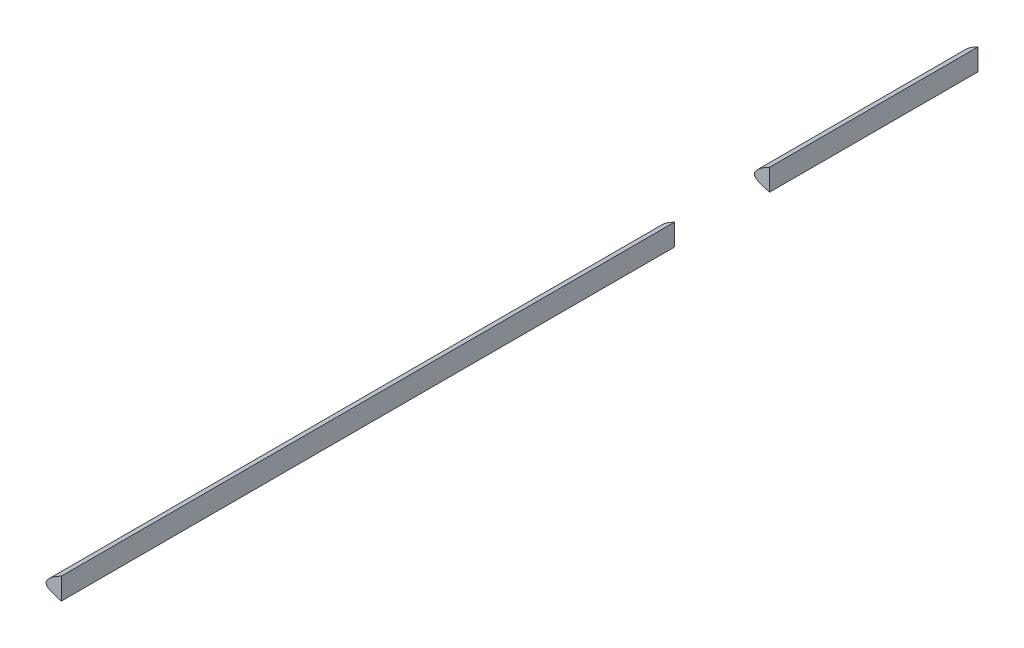
ISO-10303-21;
HEADER;
FILE_DESCRIPTION(('STEP AP214'),'2;1');
FILE_NAME('part.step','',(''),(''),'','','');
FILE_SCHEMA(('AUTOMOTIVE_DESIGN { 1 0 10303 214 1 1 1 1 }'));
ENDSEC;
DATA;
#1=APPLICATION_CONTEXT('core data for automotive mechanical design processes');
#2=APPLICATION_PROTOCOL_DEFINITION('international standard','automotive_design',2000,#1);
#3=PRODUCT_CONTEXT('',#1,'mechanical');
#4=PRODUCT('Part','Part','',(#3));
#5=PRODUCT_RELATED_PRODUCT_CATEGORY('part','',(#4));
#6=PRODUCT_DEFINITION_FORMATION('','',#4);
#7=PRODUCT_DEFINITION_CONTEXT('part definition',#1,'design');
#8=PRODUCT_DEFINITION('design','',#6,#7);
#9=PRODUCT_DEFINITION_SHAPE('','',#8);
#10=(LENGTH_UNIT() NAMED_UNIT(*) SI_UNIT(.MILLI.,.METRE.));
#11=(NAMED_UNIT(*) PLANE_ANGLE_UNIT() SI_UNIT($,.RADIAN.));
#12=(NAMED_UNIT(*) SI_UNIT($,.STERADIAN.) SOLID_ANGLE_UNIT());
#13=UNCERTAINTY_MEASURE_WITH_UNIT(LENGTH_MEASURE(1.E-05),#10,'distance_accuracy_value','');
#14=(GEOMETRIC_REPRESENTATION_CONTEXT(3) GLOBAL_UNCERTAINTY_ASSIGNED_CONTEXT((#13)) GLOBAL_UNIT_ASSIGNED_CONTEXT((#10,
#11,#12)) REPRESENTATION_CONTEXT('',''));
#15=CARTESIAN_POINT('',(0.,0.,0.));
#16=DIRECTION('',(0.,0.,1.));
#17=DIRECTION('',(1.,0.,0.));
#18=AXIS2_PLACEMENT_3D('',#15,#16,#17);
#19=CARTESIAN_POINT('',(324.9026935512,0.,-1090.34141295382));
#20=CARTESIAN_POINT('',(324.90346319559,0.0233133583806574,-1090.34141295382));
#21=CARTESIAN_POINT('',(322.493960124611,0.266874853266928,-1090.34141295382));
#22=CARTESIAN_POINT('',(320.107118726271,0.728898481684864,-1090.34141295382));
#23=CARTESIAN_POINT('',(314.479929879271,1.69659954466814,-1090.34141295382));
#24=CARTESIAN_POINT('',(307.761979309178,2.96651084650256,-1090.34141295382));
#25=CARTESIAN_POINT('',(299.156213965818,4.44402058990994,-1090.34141295382));
#26=CARTESIAN_POINT('',(289.108994082194,6.05458721176259,-1090.34141295382));
#27=CARTESIAN_POINT('',(277.614504556848,7.85862541822672,-1090.34141295382));
#28=CARTESIAN_POINT('',(264.867967681756,9.82863928319501,-1090.34141295382));
#29=CARTESIAN_POINT('',(251.037893607433,11.9464568649147,-1090.34141295382));
#30=CARTESIAN_POINT('',(236.320520328163,14.1628286822193,-1090.34141295382));
#31=CARTESIAN_POINT('',(220.915494029042,16.4347978422618,-1090.34141295382));
#32=CARTESIAN_POINT('',(205.033677241231,18.7162921045369,-1090.34141295382));
#33=CARTESIAN_POINT('',(188.883341886899,20.9229885970704,-1090.34141295382));
#34=CARTESIAN_POINT('',(172.682407247215,22.9973105242966,-1090.34141295382));
#35=CARTESIAN_POINT('',(156.622614564687,24.8301784866328,-1090.34141295382));
#36=CARTESIAN_POINT('',(140.85040765116,26.2625796247527,-1090.34141295382));
#37=CARTESIAN_POINT('',(125.478771127742,27.2050458448488,-1090.34141295382));
#38=CARTESIAN_POINT('',(110.596641231566,27.6094132257854,-1090.34141295382));
#39=CARTESIAN_POINT('',(96.2853033385808,27.4446531652477,-1090.34141295382));
#40=CARTESIAN_POINT('',(82.6164523566715,26.7221772489685,-1090.34141295382));
#41=CARTESIAN_POINT('',(69.6684349637199,25.4642524848224,-1090.34141295382));
#42=CARTESIAN_POINT('',(57.5288522663284,23.7890753252532,-1090.34141295382));
#43=CARTESIAN_POINT('',(46.3056688527853,21.7557737945352,-1090.34141295382));
#44=CARTESIAN_POINT('',(36.1124988210342,19.421560606896,-1090.34141295382));
#45=CARTESIAN_POINT('',(27.0454876777921,16.8469786053261,-1090.34141295382));
#46=CARTESIAN_POINT('',(19.1969550247217,14.0824194665185,-1090.34141295382));
#47=CARTESIAN_POINT('',(12.6195182535387,11.1953401492948,-1090.34141295382));
#48=CARTESIAN_POINT('',(7.39382924872228,8.27357700541017,-1090.34141295382));
#49=CARTESIAN_POINT('',(3.46645559888262,5.36260960395899,-1090.34141295382));
#50=CARTESIAN_POINT('',(1.0721441800177,2.69745028336921,-1090.34141295382));
#51=CARTESIAN_POINT('',(-0.44301831227786,-0.0163803086251834,-1090.34141295382));
#52=CARTESIAN_POINT('',(1.14212328936869,-2.66038157127671,-1090.34141295382));
#53=CARTESIAN_POINT('',(4.36503605971503,-4.22676457114381,-1090.34141295382));
#54=CARTESIAN_POINT('',(8.97122140423381,-6.02880941856467,-1090.34141295382));
#55=CARTESIAN_POINT('',(15.243598773671,-7.49562746974023,-1090.34141295382));
#56=CARTESIAN_POINT('',(23.0320560801708,-8.81343307785173,-1090.34141295382));
#57=CARTESIAN_POINT('',(32.3248291039904,-9.88501521121111,-1090.34141295382));
#58=CARTESIAN_POINT('',(43.02561085123,-10.7220049250572,-1090.34141295382));
#59=CARTESIAN_POINT('',(55.0370190293927,-11.3213307402037,-1090.34141295382));
#60=CARTESIAN_POINT('',(68.2344021608391,-11.6831205739109,-1090.34141295382));
#61=CARTESIAN_POINT('',(82.4768909373014,-11.8216946355356,-1090.34141295382));
#62=CARTESIAN_POINT('',(97.6058535702517,-11.7312635564645,-1090.34141295382));
#63=CARTESIAN_POINT('',(113.468681032216,-11.4146303668036,-1090.34141295382));
#64=CARTESIAN_POINT('',(129.930020512529,-10.7984705199419,-1090.34141295382));
#65=CARTESIAN_POINT('',(146.859715046732,-9.93880113727659,-1090.34141295382));
#66=CARTESIAN_POINT('',(164.102555427845,-8.95468862894909,-1090.34141295382));
#67=CARTESIAN_POINT('',(181.455347717627,-7.91418790276717,-1090.34141295382));
#68=CARTESIAN_POINT('',(198.694582838916,-6.86098310953203,-1090.34141295382));
#69=CARTESIAN_POINT('',(215.596359860735,-5.83696040869958,-1090.34141295382));
#70=CARTESIAN_POINT('',(231.942646986744,-4.86345762457903,-1090.34141295382));
#71=CARTESIAN_POINT('',(247.517899408465,-3.96716262112094,-1090.34141295382));
#72=CARTESIAN_POINT('',(262.118380872368,-3.15712058268027,-1090.34141295382));
#73=CARTESIAN_POINT('',(275.542852028211,-2.44567542809517,-1090.34141295382));
#74=CARTESIAN_POINT('',(287.622696903447,-1.83567813821833,-1090.34141295382));
#75=CARTESIAN_POINT('',(298.158964312839,-1.30681197821665,-1090.34141295382));
#76=CARTESIAN_POINT('',(307.165416690346,-0.826816663963498,-1090.34141295382));
#77=CARTESIAN_POINT('',(314.173983408068,-0.368946974828929,-1090.34141295382));
#78=CARTESIAN_POINT('',(319.999788969716,-0.117218531002151,-1090.34141295382));
#79=CARTESIAN_POINT('',(322.456899939764,0.0391125120748008,-1090.34141295382));
#80=CARTESIAN_POINT('',(324.901921434116,-0.0233882589368036,-1090.34141295382));
#81=CARTESIAN_POINT('',(324.9026935512,0.,-1090.34141295382));
#82=B_SPLINE_CURVE_WITH_KNOTS('',3,(#19,#20,#21,#22,#23,#24,#25,#26,#27,#28,#29,#30,#31,#32,#33,
#34,#35,#36,#37,#38,#39,#40,#41,#42,#43,#44,#45,#46,#47,#48,#49,#50,#51,#52,#53,#54,#55,#56,#57,
#58,#59,#60,#61,#62,#63,#64,#65,#66,#67,#68,#69,#70,#71,#72,#73,#74,#75,#76,#77,#78,#79,#80,
#81),.UNSPECIFIED.,.T.,.F.,(4,1,1,1,1,1,1,1,1,1,1,1,1,1,1,1,1,1,1,1,1,1,1,1,1,1,1,1,1,1,1,1,1,1,
1,1,1,1,1,1,1,1,1,1,1,1,1,1,1,1,1,1,1,1,1,1,1,1,1,1,4),(0.,0.00174808161666409,
0.00682736461152588,0.0148802194660928,0.0255723245187996,0.0386941569613535,0.0541707804092893,
0.0718340915004338,0.0914345327939838,0.112684613523076,0.135293128889252,0.158943981406575,
0.183314993013972,0.208069947428828,0.232879415911381,0.257398767385958,0.28138363259568,
0.304705763006072,0.32724149700788,0.348896563368039,0.369606939586334,0.389308375744097,
0.407885695760754,0.425177148613117,0.441026789913431,0.455299971521906,0.467903884546168,
0.478751648141021,0.487814349118281,0.495090030563699,0.500616983015744,0.504451368015862,
0.507803776366331,0.513091193317012,0.52054622904494,0.530249123140569,0.542213645081559,
0.556382479077403,0.572655501749116,0.590894528635496,0.610925387189739,0.632535858974259,
0.655496365431996,0.679547083246405,0.704498568619219,0.730211424578536,0.756435524546716,
0.782836661122501,0.809062449565475,0.834775916464845,0.859641281327499,0.883337826525987,
0.905540839068826,0.925965138816007,0.944326312756837,0.960365876879218,0.973929437555459,
0.984907697461011,0.993111340436855,0.998246302191831,1.),.UNSPECIFIED.);
#83=DIRECTION('',(0.,0.,1.));
#84=VECTOR('',#83,1.);
#85=SURFACE_OF_LINEAR_EXTRUSION('',#82,#84);
#86=DIRECTION('',(0.,0.,1.));
#87=VECTOR('',#86,1.);
#88=CARTESIAN_POINT('',(12.7000000000001,11.1170877286177,-761.999746));
#89=LINE('',#88,#87);
#90=CARTESIAN_POINT('',(12.7000000000001,11.1170877286177,-509.693163999995));
#91=VERTEX_POINT('',#90);
#92=CARTESIAN_POINT('',(12.7000000000001,11.1170877286177,0.));
#93=VERTEX_POINT('',#92);
#94=EDGE_CURVE('E80',#91,#93,#89,.T.);
#95=ORIENTED_EDGE('',*,*,#94,.F.);
#96=CARTESIAN_POINT('',(324.9026935512,0.,-509.693163999996));
#97=CARTESIAN_POINT('',(324.90346319559,0.0233133583806574,-509.693163999996));
#98=CARTESIAN_POINT('',(322.493960124611,0.266874853266928,-509.693163999996));
#99=CARTESIAN_POINT('',(320.107118726271,0.728898481684864,-509.693163999996));
#100=CARTESIAN_POINT('',(314.479929879271,1.69659954466814,-509.693163999996));
#101=CARTESIAN_POINT('',(307.761979309178,2.96651084650256,-509.693163999996));
#102=CARTESIAN_POINT('',(299.156213965818,4.44402058990994,-509.693163999996));
#103=CARTESIAN_POINT('',(289.108994082194,6.05458721176259,-509.693163999996));
#104=CARTESIAN_POINT('',(277.614504556848,7.85862541822672,-509.693163999996));
#105=CARTESIAN_POINT('',(264.867967681756,9.82863928319501,-509.693163999996));
#106=CARTESIAN_POINT('',(251.037893607433,11.9464568649147,-509.693163999996));
#107=CARTESIAN_POINT('',(236.320520328163,14.1628286822193,-509.693163999996));
#108=CARTESIAN_POINT('',(220.915494029042,16.4347978422618,-509.693163999996));
#109=CARTESIAN_POINT('',(205.033677241231,18.7162921045369,-509.693163999996));
#110=CARTESIAN_POINT('',(188.883341886899,20.9229885970704,-509.693163999996));
#111=CARTESIAN_POINT('',(172.682407247215,22.9973105242966,-509.693163999996));
#112=CARTESIAN_POINT('',(156.622614564687,24.8301784866328,-509.693163999996));
#113=CARTESIAN_POINT('',(140.85040765116,26.2625796247527,-509.693163999996));
#114=CARTESIAN_POINT('',(125.478771127742,27.2050458448488,-509.693163999996));
#115=CARTESIAN_POINT('',(110.596641231566,27.6094132257854,-509.693163999996));
#116=CARTESIAN_POINT('',(96.2853033385808,27.4446531652477,-509.693163999996));
#117=CARTESIAN_POINT('',(82.6164523566715,26.7221772489685,-509.693163999996));
#118=CARTESIAN_POINT('',(69.6684349637199,25.4642524848224,-509.693163999996));
#119=CARTESIAN_POINT('',(57.5288522663284,23.7890753252532,-509.693163999996));
#120=CARTESIAN_POINT('',(46.3056688527853,21.7557737945352,-509.693163999996));
#121=CARTESIAN_POINT('',(36.1124988210342,19.421560606896,-509.693163999996));
#122=CARTESIAN_POINT('',(27.0454876777921,16.8469786053261,-509.693163999996));
#123=CARTESIAN_POINT('',(19.1969550247217,14.0824194665185,-509.693163999996));
#124=CARTESIAN_POINT('',(12.6195182535387,11.1953401492948,-509.693163999996));
#125=CARTESIAN_POINT('',(7.39382924872228,8.27357700541017,-509.693163999996));
#126=CARTESIAN_POINT('',(3.46645559888262,5.36260960395899,-509.693163999996));
#127=CARTESIAN_POINT('',(1.0721441800177,2.69745028336921,-509.693163999996));
#128=CARTESIAN_POINT('',(-0.44301831227786,-0.0163803086251834,-509.693163999996));
#129=CARTESIAN_POINT('',(1.14212328936869,-2.66038157127671,-509.693163999996));
#130=CARTESIAN_POINT('',(4.36503605971503,-4.22676457114381,-509.693163999996));
#131=CARTESIAN_POINT('',(8.97122140423381,-6.02880941856467,-509.693163999996));
#132=CARTESIAN_POINT('',(15.243598773671,-7.49562746974023,-509.693163999996));
#133=CARTESIAN_POINT('',(23.0320560801708,-8.81343307785173,-509.693163999996));
#134=CARTESIAN_POINT('',(32.3248291039904,-9.88501521121111,-509.693163999996));
#135=CARTESIAN_POINT('',(43.02561085123,-10.7220049250572,-509.693163999996));
#136=CARTESIAN_POINT('',(55.0370190293927,-11.3213307402037,-509.693163999996));
#137=CARTESIAN_POINT('',(68.2344021608391,-11.6831205739109,-509.693163999996));
#138=CARTESIAN_POINT('',(82.4768909373014,-11.8216946355356,-509.693163999996));
#139=CARTESIAN_POINT('',(97.6058535702517,-11.7312635564645,-509.693163999996));
#140=CARTESIAN_POINT('',(113.468681032216,-11.4146303668036,-509.693163999996));
#141=CARTESIAN_POINT('',(129.930020512529,-10.7984705199419,-509.693163999996));
#142=CARTESIAN_POINT('',(146.859715046732,-9.93880113727659,-509.693163999996));
#143=CARTESIAN_POINT('',(164.102555427845,-8.95468862894909,-509.693163999996));
#144=CARTESIAN_POINT('',(181.455347717627,-7.91418790276717,-509.693163999996));
#145=CARTESIAN_POINT('',(198.694582838916,-6.86098310953203,-509.693163999996));
#146=CARTESIAN_POINT('',(215.596359860735,-5.83696040869958,-509.693163999996));
#147=CARTESIAN_POINT('',(231.942646986744,-4.86345762457903,-509.693163999996));
#148=CARTESIAN_POINT('',(247.517899408465,-3.96716262112094,-509.693163999996));
#149=CARTESIAN_POINT('',(262.118380872368,-3.15712058268027,-509.693163999996));
#150=CARTESIAN_POINT('',(275.542852028211,-2.44567542809517,-509.693163999996));
#151=CARTESIAN_POINT('',(287.622696903447,-1.83567813821833,-509.693163999996));
#152=CARTESIAN_POINT('',(298.158964312839,-1.30681197821665,-509.693163999996));
#153=CARTESIAN_POINT('',(307.165416690346,-0.826816663963498,-509.693163999996));
#154=CARTESIAN_POINT('',(314.173983408068,-0.368946974828929,-509.693163999996));
#155=CARTESIAN_POINT('',(319.999788969716,-0.117218531002151,-509.693163999996));
#156=CARTESIAN_POINT('',(322.456899939764,0.0391125120748008,-509.693163999996));
#157=CARTESIAN_POINT('',(324.901921434116,-0.0233882589368036,-509.693163999996));
#158=CARTESIAN_POINT('',(324.9026935512,0.,-509.693163999996));
#159=B_SPLINE_CURVE_WITH_KNOTS('',3,(#96,#97,#98,#99,#100,#101,#102,#103,#104,#105,#106,#107,
#108,#109,#110,#111,#112,#113,#114,#115,#116,#117,#118,#119,#120,#121,#122,#123,#124,#125,#126,
#127,#128,#129,#130,#131,#132,#133,#134,#135,#136,#137,#138,#139,#140,#141,#142,#143,#144,#145,
#146,#147,#148,#149,#150,#151,#152,#153,#154,#155,#156,#157,#158),.UNSPECIFIED.,.T.,.F.,(4,1,1,
1,1,1,1,1,1,1,1,1,1,1,1,1,1,1,1,1,1,1,1,1,1,1,1,1,1,1,1,1,1,1,1,1,1,1,1,1,1,1,1,1,1,1,1,1,1,1,1,
1,1,1,1,1,1,1,1,1,4),(0.,0.00174808161666409,0.00682736461152588,0.0148802194660928,
0.0255723245187996,0.0386941569613535,0.0541707804092893,0.0718340915004338,0.0914345327939838,
0.112684613523076,0.135293128889252,0.158943981406575,0.183314993013972,0.208069947428828,
0.232879415911381,0.257398767385958,0.28138363259568,0.304705763006072,0.32724149700788,
0.348896563368039,0.369606939586334,0.389308375744097,0.407885695760754,0.425177148613117,
0.441026789913431,0.455299971521906,0.467903884546168,0.478751648141021,0.487814349118281,
0.495090030563699,0.500616983015744,0.504451368015862,0.507803776366331,0.513091193317012,
0.52054622904494,0.530249123140569,0.542213645081559,0.556382479077403,0.572655501749116,
0.590894528635496,0.610925387189739,0.632535858974259,0.655496365431996,0.679547083246405,
0.704498568619219,0.730211424578536,0.756435524546716,0.782836661122501,0.809062449565475,
0.834775916464845,0.859641281327499,0.883337826525987,0.905540839068826,0.925965138816007,
0.944326312756837,0.960365876879218,0.973929437555459,0.984907697461011,0.993111340436855,
0.998246302191831,1.),.UNSPECIFIED.);
#160=CARTESIAN_POINT('',(12.7000000000001,-6.87603561469755,-509.693163999995));
#161=VERTEX_POINT('',#160);
#162=EDGE_CURVE('E70',#91,#161,#159,.T.);
#163=ORIENTED_EDGE('',*,*,#162,.T.);
#164=DIRECTION('',(0.,0.,1.));
#165=VECTOR('',#164,1.);
#166=CARTESIAN_POINT('',(12.7000000000001,-6.87603561469755,-761.999746));
#167=LINE('',#166,#165);
#168=CARTESIAN_POINT('',(12.7000000000001,-6.87603561469755,0.));
#169=VERTEX_POINT('',#168);
#170=EDGE_CURVE('E92',#161,#169,#167,.T.);
#171=ORIENTED_EDGE('',*,*,#170,.T.);
#172=CARTESIAN_POINT('',(324.9026935512,0.,0.));
#173=CARTESIAN_POINT('',(324.90346319559,0.0233133583806574,0.));
#174=CARTESIAN_POINT('',(322.493960124611,0.266874853266928,0.));
#175=CARTESIAN_POINT('',(320.107118726271,0.728898481684864,0.));
#176=CARTESIAN_POINT('',(314.479929879271,1.69659954466814,0.));
#177=CARTESIAN_POINT('',(307.761979309178,2.96651084650256,0.));
#178=CARTESIAN_POINT('',(299.156213965818,4.44402058990994,0.));
#179=CARTESIAN_POINT('',(289.108994082194,6.05458721176259,0.));
#180=CARTESIAN_POINT('',(277.614504556848,7.85862541822672,0.));
#181=CARTESIAN_POINT('',(264.867967681756,9.82863928319501,0.));
#182=CARTESIAN_POINT('',(251.037893607433,11.9464568649147,0.));
#183=CARTESIAN_POINT('',(236.320520328163,14.1628286822193,0.));
#184=CARTESIAN_POINT('',(220.915494029042,16.4347978422618,0.));
#185=CARTESIAN_POINT('',(205.033677241231,18.7162921045369,0.));
#186=CARTESIAN_POINT('',(188.883341886899,20.9229885970704,0.));
#187=CARTESIAN_POINT('',(172.682407247215,22.9973105242966,0.));
#188=CARTESIAN_POINT('',(156.622614564687,24.8301784866328,0.));
#189=CARTESIAN_POINT('',(140.85040765116,26.2625796247527,0.));
#190=CARTESIAN_POINT('',(125.478771127742,27.2050458448488,0.));
#191=CARTESIAN_POINT('',(110.596641231566,27.6094132257854,0.));
#192=CARTESIAN_POINT('',(96.2853033385808,27.4446531652477,0.));
#193=CARTESIAN_POINT('',(82.6164523566715,26.7221772489685,0.));
#194=CARTESIAN_POINT('',(69.6684349637199,25.4642524848224,0.));
#195=CARTESIAN_POINT('',(57.5288522663284,23.7890753252532,0.));
#196=CARTESIAN_POINT('',(46.3056688527853,21.7557737945352,0.));
#197=CARTESIAN_POINT('',(36.1124988210342,19.421560606896,0.));
#198=CARTESIAN_POINT('',(27.0454876777921,16.8469786053261,0.));
#199=CARTESIAN_POINT('',(19.1969550247217,14.0824194665185,0.));
#200=CARTESIAN_POINT('',(12.6195182535387,11.1953401492948,0.));
#201=CARTESIAN_POINT('',(7.39382924872228,8.27357700541017,0.));
#202=CARTESIAN_POINT('',(3.46645559888262,5.36260960395899,0.));
#203=CARTESIAN_POINT('',(1.0721441800177,2.69745028336921,0.));
#204=CARTESIAN_POINT('',(-0.44301831227786,-0.0163803086251834,0.));
#205=CARTESIAN_POINT('',(1.14212328936869,-2.66038157127671,0.));
#206=CARTESIAN_POINT('',(4.36503605971503,-4.22676457114381,0.));
#207=CARTESIAN_POINT('',(8.97122140423381,-6.02880941856467,0.));
#208=CARTESIAN_POINT('',(15.243598773671,-7.49562746974023,0.));
#209=CARTESIAN_POINT('',(23.0320560801708,-8.81343307785173,0.));
#210=CARTESIAN_POINT('',(32.3248291039904,-9.88501521121111,0.));
#211=CARTESIAN_POINT('',(43.02561085123,-10.7220049250572,0.));
#212=CARTESIAN_POINT('',(55.0370190293927,-11.3213307402037,0.));
#213=CARTESIAN_POINT('',(68.2344021608391,-11.6831205739109,0.));
#214=CARTESIAN_POINT('',(82.4768909373014,-11.8216946355356,0.));
#215=CARTESIAN_POINT('',(97.6058535702517,-11.7312635564645,0.));
#216=CARTESIAN_POINT('',(113.468681032216,-11.4146303668036,0.));
#217=CARTESIAN_POINT('',(129.930020512529,-10.7984705199419,0.));
#218=CARTESIAN_POINT('',(146.859715046732,-9.93880113727659,0.));
#219=CARTESIAN_POINT('',(164.102555427845,-8.95468862894909,0.));
#220=CARTESIAN_POINT('',(181.455347717627,-7.91418790276717,0.));
#221=CARTESIAN_POINT('',(198.694582838916,-6.86098310953203,0.));
#222=CARTESIAN_POINT('',(215.596359860735,-5.83696040869958,0.));
#223=CARTESIAN_POINT('',(231.942646986744,-4.86345762457903,0.));
#224=CARTESIAN_POINT('',(247.517899408465,-3.96716262112094,0.));
#225=CARTESIAN_POINT('',(262.118380872368,-3.15712058268027,0.));
#226=CARTESIAN_POINT('',(275.542852028211,-2.44567542809517,0.));
#227=CARTESIAN_POINT('',(287.622696903447,-1.83567813821833,0.));
#228=CARTESIAN_POINT('',(298.158964312839,-1.30681197821665,0.));
#229=CARTESIAN_POINT('',(307.165416690346,-0.826816663963498,0.));
#230=CARTESIAN_POINT('',(314.173983408068,-0.368946974828929,0.));
#231=CARTESIAN_POINT('',(319.999788969716,-0.117218531002151,0.));
#232=CARTESIAN_POINT('',(322.456899939764,0.0391125120748008,0.));
#233=CARTESIAN_POINT('',(324.901921434116,-0.0233882589368036,0.));
#234=CARTESIAN_POINT('',(324.9026935512,0.,0.));
#235=B_SPLINE_CURVE_WITH_KNOTS('',3,(#172,#173,#174,#175,#176,#177,#178,#179,#180,#181,#182,
#183,#184,#185,#186,#187,#188,#189,#190,#191,#192,#193,#194,#195,#196,#197,#198,#199,#200,#201,
#202,#203,#204,#205,#206,#207,#208,#209,#210,#211,#212,#213,#214,#215,#216,#217,#218,#219,#220,
#221,#222,#223,#224,#225,#226,#227,#228,#229,#230,#231,#232,#233,#234),.UNSPECIFIED.,.T.,.F.,(4,
1,1,1,1,1,1,1,1,1,1,1,1,1,1,1,1,1,1,1,1,1,1,1,1,1,1,1,1,1,1,1,1,1,1,1,1,1,1,1,1,1,1,1,1,1,1,1,1,
1,1,1,1,1,1,1,1,1,1,1,4),(0.,0.00174808161666409,0.00682736461152588,0.0148802194660928,
0.0255723245187996,0.0386941569613535,0.0541707804092893,0.0718340915004338,0.0914345327939838,
0.112684613523076,0.135293128889252,0.158943981406575,0.183314993013972,0.208069947428828,
0.232879415911381,0.257398767385958,0.28138363259568,0.304705763006072,0.32724149700788,
0.348896563368039,0.369606939586334,0.389308375744097,0.407885695760754,0.425177148613117,
0.441026789913431,0.455299971521906,0.467903884546168,0.478751648141021,0.487814349118281,
0.495090030563699,0.500616983015744,0.504451368015862,0.507803776366331,0.513091193317012,
0.52054622904494,0.530249123140569,0.542213645081559,0.556382479077403,0.572655501749116,
0.590894528635496,0.610925387189739,0.632535858974259,0.655496365431996,0.679547083246405,
0.704498568619219,0.730211424578536,0.756435524546716,0.782836661122501,0.809062449565475,
0.834775916464845,0.859641281327499,0.883337826525987,0.905540839068826,0.925965138816007,
0.944326312756837,0.960365876879218,0.973929437555459,0.984907697461011,0.993111340436855,
0.998246302191831,1.),.UNSPECIFIED.);
#236=EDGE_CURVE('E12',#93,#169,#235,.T.);
#237=ORIENTED_EDGE('',*,*,#236,.F.);
#238=EDGE_LOOP('',(#95,#163,#171,#237));
#239=FACE_BOUND('',#238,.T.);
#240=ADVANCED_FACE('F51',(#239),#85,.T.);
#241=CARTESIAN_POINT('',(12.7000000000001,0.,-761.999746));
#242=DIRECTION('',(-1.,0.,0.));
#243=DIRECTION('',(0.,-1.,0.));
#244=AXIS2_PLACEMENT_3D('',#241,#242,#243);
#245=PLANE('',#244);
#246=DIRECTION('',(0.,1.,0.));
#247=VECTOR('',#246,1.);
#248=CARTESIAN_POINT('',(12.7000000000001,11.1170877286177,-509.693163999995));
#249=LINE('',#248,#247);
#250=EDGE_CURVE('E84',#161,#91,#249,.T.);
#251=ORIENTED_EDGE('',*,*,#250,.T.);
#252=ORIENTED_EDGE('',*,*,#94,.T.);
#253=DIRECTION('',(0.,-1.,0.));
#254=VECTOR('',#253,1.);
#255=CARTESIAN_POINT('',(12.7000000000001,0.,0.));
#256=LINE('',#255,#254);
#257=EDGE_CURVE('E63',#93,#169,#256,.T.);
#258=ORIENTED_EDGE('',*,*,#257,.T.);
#259=ORIENTED_EDGE('',*,*,#170,.F.);
#260=EDGE_LOOP('',(#251,#252,#258,#259));
#261=FACE_BOUND('',#260,.T.);
#262=ADVANCED_FACE('F82',(#261),#245,.F.);
#263=CARTESIAN_POINT('',(1.15165455923713,2.60088125935629,0.));
#264=DIRECTION('',(0.,0.,-1.));
#265=DIRECTION('',(-1.,0.,0.));
#266=AXIS2_PLACEMENT_3D('',#263,#264,#265);
#267=PLANE('',#266);
#268=ORIENTED_EDGE('',*,*,#236,.T.);
#269=ORIENTED_EDGE('',*,*,#257,.F.);
#270=EDGE_LOOP('',(#268,#269));
#271=FACE_BOUND('',#270,.T.);
#272=ADVANCED_FACE('F89',(#271),#267,.F.);
#273=CARTESIAN_POINT('',(93.7448001553549,11.1170877286177,-509.693163999995));
#274=DIRECTION('',(0.,0.,-1.));
#275=DIRECTION('',(-1.,0.,0.));
#276=AXIS2_PLACEMENT_3D('',#273,#274,#275);
#277=PLANE('',#276);
#278=ORIENTED_EDGE('',*,*,#250,.F.);
#279=ORIENTED_EDGE('',*,*,#162,.F.);
#280=EDGE_LOOP('',(#278,#279));
#281=FACE_BOUND('',#280,.T.);
#282=ADVANCED_FACE('F109',(#281),#277,.T.);
#283=CLOSED_SHELL('',(#240,#262,#272,#282));
#284=MANIFOLD_SOLID_BREP('B2',#283);
#285=CARTESIAN_POINT('',(1.15165455923713,2.60088125935629,-761.999746));
#286=DIRECTION('',(0.,0.,-1.));
#287=DIRECTION('',(-1.,0.,0.));
#288=AXIS2_PLACEMENT_3D('',#285,#286,#287);
#289=PLANE('',#288);
#290=DIRECTION('',(0.,-1.,0.));
#291=VECTOR('',#290,1.);
#292=CARTESIAN_POINT('',(12.7000000000001,0.,-761.999746));
#293=LINE('',#292,#291);
#294=CARTESIAN_POINT('',(12.7000000000001,11.1170877286177,-761.999746));
#295=VERTEX_POINT('',#294);
#296=CARTESIAN_POINT('',(12.7000000000001,-6.87603561469755,-761.999746));
#297=VERTEX_POINT('',#296);
#298=EDGE_CURVE('E185',#295,#297,#293,.T.);
#299=ORIENTED_EDGE('',*,*,#298,.T.);
#300=CARTESIAN_POINT('',(324.9026935512,0.,-761.999746));
#301=CARTESIAN_POINT('',(324.90346319559,0.0233133583806574,-761.999746));
#302=CARTESIAN_POINT('',(322.493960124611,0.266874853266928,-761.999746));
#303=CARTESIAN_POINT('',(320.107118726271,0.728898481684864,-761.999746));
#304=CARTESIAN_POINT('',(314.479929879271,1.69659954466814,-761.999746));
#305=CARTESIAN_POINT('',(307.761979309178,2.96651084650256,-761.999746));
#306=CARTESIAN_POINT('',(299.156213965818,4.44402058990994,-761.999746));
#307=CARTESIAN_POINT('',(289.108994082194,6.05458721176259,-761.999746));
#308=CARTESIAN_POINT('',(277.614504556848,7.85862541822672,-761.999746));
#309=CARTESIAN_POINT('',(264.867967681756,9.82863928319501,-761.999746));
#310=CARTESIAN_POINT('',(251.037893607433,11.9464568649147,-761.999746));
#311=CARTESIAN_POINT('',(236.320520328163,14.1628286822193,-761.999746));
#312=CARTESIAN_POINT('',(220.915494029042,16.4347978422618,-761.999746));
#313=CARTESIAN_POINT('',(205.033677241231,18.7162921045369,-761.999746));
#314=CARTESIAN_POINT('',(188.883341886899,20.9229885970704,-761.999746));
#315=CARTESIAN_POINT('',(172.682407247215,22.9973105242966,-761.999746));
#316=CARTESIAN_POINT('',(156.622614564687,24.8301784866328,-761.999746));
#317=CARTESIAN_POINT('',(140.85040765116,26.2625796247527,-761.999746));
#318=CARTESIAN_POINT('',(125.478771127742,27.2050458448488,-761.999746));
#319=CARTESIAN_POINT('',(110.596641231566,27.6094132257854,-761.999746));
#320=CARTESIAN_POINT('',(96.2853033385808,27.4446531652477,-761.999746));
#321=CARTESIAN_POINT('',(82.6164523566715,26.7221772489685,-761.999746));
#322=CARTESIAN_POINT('',(69.6684349637199,25.4642524848224,-761.999746));
#323=CARTESIAN_POINT('',(57.5288522663284,23.7890753252532,-761.999746));
#324=CARTESIAN_POINT('',(46.3056688527853,21.7557737945352,-761.999746));
#325=CARTESIAN_POINT('',(36.1124988210342,19.421560606896,-761.999746));
#326=CARTESIAN_POINT('',(27.0454876777921,16.8469786053261,-761.999746));
#327=CARTESIAN_POINT('',(19.1969550247217,14.0824194665185,-761.999746));
#328=CARTESIAN_POINT('',(12.6195182535387,11.1953401492948,-761.999746));
#329=CARTESIAN_POINT('',(7.39382924872228,8.27357700541017,-761.999746));
#330=CARTESIAN_POINT('',(3.46645559888262,5.36260960395899,-761.999746));
#331=CARTESIAN_POINT('',(1.0721441800177,2.69745028336921,-761.999746));
#332=CARTESIAN_POINT('',(-0.44301831227786,-0.0163803086251834,-761.999746));
#333=CARTESIAN_POINT('',(1.14212328936869,-2.66038157127671,-761.999746));
#334=CARTESIAN_POINT('',(4.36503605971503,-4.22676457114381,-761.999746));
#335=CARTESIAN_POINT('',(8.97122140423381,-6.02880941856467,-761.999746));
#336=CARTESIAN_POINT('',(15.243598773671,-7.49562746974023,-761.999746));
#337=CARTESIAN_POINT('',(23.0320560801708,-8.81343307785173,-761.999746));
#338=CARTESIAN_POINT('',(32.3248291039904,-9.88501521121111,-761.999746));
#339=CARTESIAN_POINT('',(43.02561085123,-10.7220049250572,-761.999746));
#340=CARTESIAN_POINT('',(55.0370190293927,-11.3213307402037,-761.999746));
#341=CARTESIAN_POINT('',(68.2344021608391,-11.6831205739109,-761.999746));
#342=CARTESIAN_POINT('',(82.4768909373014,-11.8216946355356,-761.999746));
#343=CARTESIAN_POINT('',(97.6058535702517,-11.7312635564645,-761.999746));
#344=CARTESIAN_POINT('',(113.468681032216,-11.4146303668036,-761.999746));
#345=CARTESIAN_POINT('',(129.930020512529,-10.7984705199419,-761.999746));
#346=CARTESIAN_POINT('',(146.859715046732,-9.93880113727659,-761.999746));
#347=CARTESIAN_POINT('',(164.102555427845,-8.95468862894909,-761.999746));
#348=CARTESIAN_POINT('',(181.455347717627,-7.91418790276717,-761.999746));
#349=CARTESIAN_POINT('',(198.694582838916,-6.86098310953203,-761.999746));
#350=CARTESIAN_POINT('',(215.596359860735,-5.83696040869958,-761.999746));
#351=CARTESIAN_POINT('',(231.942646986744,-4.86345762457903,-761.999746));
#352=CARTESIAN_POINT('',(247.517899408465,-3.96716262112094,-761.999746));
#353=CARTESIAN_POINT('',(262.118380872368,-3.15712058268027,-761.999746));
#354=CARTESIAN_POINT('',(275.542852028211,-2.44567542809517,-761.999746));
#355=CARTESIAN_POINT('',(287.622696903447,-1.83567813821833,-761.999746));
#356=CARTESIAN_POINT('',(298.158964312839,-1.30681197821665,-761.999746));
#357=CARTESIAN_POINT('',(307.165416690346,-0.826816663963498,-761.999746));
#358=CARTESIAN_POINT('',(314.173983408068,-0.368946974828929,-761.999746));
#359=CARTESIAN_POINT('',(319.999788969716,-0.117218531002151,-761.999746));
#360=CARTESIAN_POINT('',(322.456899939764,0.0391125120748008,-761.999746));
#361=CARTESIAN_POINT('',(324.901921434116,-0.0233882589368036,-761.999746));
#362=CARTESIAN_POINT('',(324.9026935512,0.,-761.999746));
#363=B_SPLINE_CURVE_WITH_KNOTS('',3,(#300,#301,#302,#303,#304,#305,#306,#307,#308,#309,#310,
#311,#312,#313,#314,#315,#316,#317,#318,#319,#320,#321,#322,#323,#324,#325,#326,#327,#328,#329,
#330,#331,#332,#333,#334,#335,#336,#337,#338,#339,#340,#341,#342,#343,#344,#345,#346,#347,#348,
#349,#350,#351,#352,#353,#354,#355,#356,#357,#358,#359,#360,#361,#362),.UNSPECIFIED.,.T.,.F.,(4,
1,1,1,1,1,1,1,1,1,1,1,1,1,1,1,1,1,1,1,1,1,1,1,1,1,1,1,1,1,1,1,1,1,1,1,1,1,1,1,1,1,1,1,1,1,1,1,1,
1,1,1,1,1,1,1,1,1,1,1,4),(0.,0.00174808161666409,0.00682736461152588,0.0148802194660928,
0.0255723245187996,0.0386941569613535,0.0541707804092893,0.0718340915004338,0.0914345327939838,
0.112684613523076,0.135293128889252,0.158943981406575,0.183314993013972,0.208069947428828,
0.232879415911381,0.257398767385958,0.28138363259568,0.304705763006072,0.32724149700788,
0.348896563368039,0.369606939586334,0.389308375744097,0.407885695760754,0.425177148613117,
0.441026789913431,0.455299971521906,0.467903884546168,0.478751648141021,0.487814349118281,
0.495090030563699,0.500616983015744,0.504451368015862,0.507803776366331,0.513091193317012,
0.52054622904494,0.530249123140569,0.542213645081559,0.556382479077403,0.572655501749116,
0.590894528635496,0.610925387189739,0.632535858974259,0.655496365431996,0.679547083246405,
0.704498568619219,0.730211424578536,0.756435524546716,0.782836661122501,0.809062449565475,
0.834775916464845,0.859641281327499,0.883337826525987,0.905540839068826,0.925965138816007,
0.944326312756837,0.960365876879218,0.973929437555459,0.984907697461011,0.993111340436855,
0.998246302191831,1.),.UNSPECIFIED.);
#364=EDGE_CURVE('E49',#295,#297,#363,.T.);
#365=ORIENTED_EDGE('',*,*,#364,.F.);
#366=EDGE_LOOP('',(#299,#365));
#367=FACE_BOUND('',#366,.T.);
#368=ADVANCED_FACE('F149',(#367),#289,.T.);
#369=CARTESIAN_POINT('',(12.7000000000001,0.,-761.999746));
#370=DIRECTION('',(-1.,0.,0.));
#371=DIRECTION('',(0.,-1.,0.));
#372=AXIS2_PLACEMENT_3D('',#369,#370,#371);
#373=PLANE('',#372);
#374=DIRECTION('',(0.,0.,1.));
#375=VECTOR('',#374,1.);
#376=CARTESIAN_POINT('',(12.7000000000001,11.1170877286177,-761.999746));
#377=LINE('',#376,#375);
#378=CARTESIAN_POINT('',(12.7000000000001,11.1170877286177,-588.715357999995));
#379=VERTEX_POINT('',#378);
#380=EDGE_CURVE('E183',#295,#379,#377,.T.);
#381=ORIENTED_EDGE('',*,*,#380,.T.);
#382=DIRECTION('',(0.,1.,0.));
#383=VECTOR('',#382,1.);
#384=CARTESIAN_POINT('',(12.7000000000001,11.1170877286177,-588.715357999995));
#385=LINE('',#384,#383);
#386=CARTESIAN_POINT('',(12.7000000000001,-6.87603561469755,-588.715357999995));
#387=VERTEX_POINT('',#386);
#388=EDGE_CURVE('E176',#387,#379,#385,.T.);
#389=ORIENTED_EDGE('',*,*,#388,.F.);
#390=DIRECTION('',(0.,0.,1.));
#391=VECTOR('',#390,1.);
#392=CARTESIAN_POINT('',(12.7000000000001,-6.87603561469755,-761.999746));
#393=LINE('',#392,#391);
#394=EDGE_CURVE('E159',#297,#387,#393,.T.);
#395=ORIENTED_EDGE('',*,*,#394,.F.);
#396=ORIENTED_EDGE('',*,*,#298,.F.);
#397=EDGE_LOOP('',(#381,#389,#395,#396));
#398=FACE_BOUND('',#397,.T.);
#399=ADVANCED_FACE('F187',(#398),#373,.F.);
#400=CARTESIAN_POINT('',(324.9026935512,0.,-1090.34141295382));
#401=CARTESIAN_POINT('',(324.90346319559,0.0233133583806574,-1090.34141295382));
#402=CARTESIAN_POINT('',(322.493960124611,0.266874853266928,-1090.34141295382));
#403=CARTESIAN_POINT('',(320.107118726271,0.728898481684864,-1090.34141295382));
#404=CARTESIAN_POINT('',(314.479929879271,1.69659954466814,-1090.34141295382));
#405=CARTESIAN_POINT('',(307.761979309178,2.96651084650256,-1090.34141295382));
#406=CARTESIAN_POINT('',(299.156213965818,4.44402058990994,-1090.34141295382));
#407=CARTESIAN_POINT('',(289.108994082194,6.05458721176259,-1090.34141295382));
#408=CARTESIAN_POINT('',(277.614504556848,7.85862541822672,-1090.34141295382));
#409=CARTESIAN_POINT('',(264.867967681756,9.82863928319501,-1090.34141295382));
#410=CARTESIAN_POINT('',(251.037893607433,11.9464568649147,-1090.34141295382));
#411=CARTESIAN_POINT('',(236.320520328163,14.1628286822193,-1090.34141295382));
#412=CARTESIAN_POINT('',(220.915494029042,16.4347978422618,-1090.34141295382));
#413=CARTESIAN_POINT('',(205.033677241231,18.7162921045369,-1090.34141295382));
#414=CARTESIAN_POINT('',(188.883341886899,20.9229885970704,-1090.34141295382));
#415=CARTESIAN_POINT('',(172.682407247215,22.9973105242966,-1090.34141295382));
#416=CARTESIAN_POINT('',(156.622614564687,24.8301784866328,-1090.34141295382));
#417=CARTESIAN_POINT('',(140.85040765116,26.2625796247527,-1090.34141295382));
#418=CARTESIAN_POINT('',(125.478771127742,27.2050458448488,-1090.34141295382));
#419=CARTESIAN_POINT('',(110.596641231566,27.6094132257854,-1090.34141295382));
#420=CARTESIAN_POINT('',(96.2853033385808,27.4446531652477,-1090.34141295382));
#421=CARTESIAN_POINT('',(82.6164523566715,26.7221772489685,-1090.34141295382));
#422=CARTESIAN_POINT('',(69.6684349637199,25.4642524848224,-1090.34141295382));
#423=CARTESIAN_POINT('',(57.5288522663284,23.7890753252532,-1090.34141295382));
#424=CARTESIAN_POINT('',(46.3056688527853,21.7557737945352,-1090.34141295382));
#425=CARTESIAN_POINT('',(36.1124988210342,19.421560606896,-1090.34141295382));
#426=CARTESIAN_POINT('',(27.0454876777921,16.8469786053261,-1090.34141295382));
#427=CARTESIAN_POINT('',(19.1969550247217,14.0824194665185,-1090.34141295382));
#428=CARTESIAN_POINT('',(12.6195182535387,11.1953401492948,-1090.34141295382));
#429=CARTESIAN_POINT('',(7.39382924872228,8.27357700541017,-1090.34141295382));
#430=CARTESIAN_POINT('',(3.46645559888262,5.36260960395899,-1090.34141295382));
#431=CARTESIAN_POINT('',(1.0721441800177,2.69745028336921,-1090.34141295382));
#432=CARTESIAN_POINT('',(-0.44301831227786,-0.0163803086251834,-1090.34141295382));
#433=CARTESIAN_POINT('',(1.14212328936869,-2.66038157127671,-1090.34141295382));
#434=CARTESIAN_POINT('',(4.36503605971503,-4.22676457114381,-1090.34141295382));
#435=CARTESIAN_POINT('',(8.97122140423381,-6.02880941856467,-1090.34141295382));
#436=CARTESIAN_POINT('',(15.243598773671,-7.49562746974023,-1090.34141295382));
#437=CARTESIAN_POINT('',(23.0320560801708,-8.81343307785173,-1090.34141295382));
#438=CARTESIAN_POINT('',(32.3248291039904,-9.88501521121111,-1090.34141295382));
#439=CARTESIAN_POINT('',(43.02561085123,-10.7220049250572,-1090.34141295382));
#440=CARTESIAN_POINT('',(55.0370190293927,-11.3213307402037,-1090.34141295382));
#441=CARTESIAN_POINT('',(68.2344021608391,-11.6831205739109,-1090.34141295382));
#442=CARTESIAN_POINT('',(82.4768909373014,-11.8216946355356,-1090.34141295382));
#443=CARTESIAN_POINT('',(97.6058535702517,-11.7312635564645,-1090.34141295382));
#444=CARTESIAN_POINT('',(113.468681032216,-11.4146303668036,-1090.34141295382));
#445=CARTESIAN_POINT('',(129.930020512529,-10.7984705199419,-1090.34141295382));
#446=CARTESIAN_POINT('',(146.859715046732,-9.93880113727659,-1090.34141295382));
#447=CARTESIAN_POINT('',(164.102555427845,-8.95468862894909,-1090.34141295382));
#448=CARTESIAN_POINT('',(181.455347717627,-7.91418790276717,-1090.34141295382));
#449=CARTESIAN_POINT('',(198.694582838916,-6.86098310953203,-1090.34141295382));
#450=CARTESIAN_POINT('',(215.596359860735,-5.83696040869958,-1090.34141295382));
#451=CARTESIAN_POINT('',(231.942646986744,-4.86345762457903,-1090.34141295382));
#452=CARTESIAN_POINT('',(247.517899408465,-3.96716262112094,-1090.34141295382));
#453=CARTESIAN_POINT('',(262.118380872368,-3.15712058268027,-1090.34141295382));
#454=CARTESIAN_POINT('',(275.542852028211,-2.44567542809517,-1090.34141295382));
#455=CARTESIAN_POINT('',(287.622696903447,-1.83567813821833,-1090.34141295382));
#456=CARTESIAN_POINT('',(298.158964312839,-1.30681197821665,-1090.34141295382));
#457=CARTESIAN_POINT('',(307.165416690346,-0.826816663963498,-1090.34141295382));
#458=CARTESIAN_POINT('',(314.173983408068,-0.368946974828929,-1090.34141295382));
#459=CARTESIAN_POINT('',(319.999788969716,-0.117218531002151,-1090.34141295382));
#460=CARTESIAN_POINT('',(322.456899939764,0.0391125120748008,-1090.34141295382));
#461=CARTESIAN_POINT('',(324.901921434116,-0.0233882589368036,-1090.34141295382));
#462=CARTESIAN_POINT('',(324.9026935512,0.,-1090.34141295382));
#463=B_SPLINE_CURVE_WITH_KNOTS('',3,(#400,#401,#402,#403,#404,#405,#406,#407,#408,#409,#410,
#411,#412,#413,#414,#415,#416,#417,#418,#419,#420,#421,#422,#423,#424,#425,#426,#427,#428,#429,
#430,#431,#432,#433,#434,#435,#436,#437,#438,#439,#440,#441,#442,#443,#444,#445,#446,#447,#448,
#449,#450,#451,#452,#453,#454,#455,#456,#457,#458,#459,#460,#461,#462),.UNSPECIFIED.,.T.,.F.,(4,
1,1,1,1,1,1,1,1,1,1,1,1,1,1,1,1,1,1,1,1,1,1,1,1,1,1,1,1,1,1,1,1,1,1,1,1,1,1,1,1,1,1,1,1,1,1,1,1,
1,1,1,1,1,1,1,1,1,1,1,4),(0.,0.00174808161666409,0.00682736461152588,0.0148802194660928,
0.0255723245187996,0.0386941569613535,0.0541707804092893,0.0718340915004338,0.0914345327939838,
0.112684613523076,0.135293128889252,0.158943981406575,0.183314993013972,0.208069947428828,
0.232879415911381,0.257398767385958,0.28138363259568,0.304705763006072,0.32724149700788,
0.348896563368039,0.369606939586334,0.389308375744097,0.407885695760754,0.425177148613117,
0.441026789913431,0.455299971521906,0.467903884546168,0.478751648141021,0.487814349118281,
0.495090030563699,0.500616983015744,0.504451368015862,0.507803776366331,0.513091193317012,
0.52054622904494,0.530249123140569,0.542213645081559,0.556382479077403,0.572655501749116,
0.590894528635496,0.610925387189739,0.632535858974259,0.655496365431996,0.679547083246405,
0.704498568619219,0.730211424578536,0.756435524546716,0.782836661122501,0.809062449565475,
0.834775916464845,0.859641281327499,0.883337826525987,0.905540839068826,0.925965138816007,
0.944326312756837,0.960365876879218,0.973929437555459,0.984907697461011,0.993111340436855,
0.998246302191831,1.),.UNSPECIFIED.);
#464=DIRECTION('',(0.,0.,1.));
#465=VECTOR('',#464,1.);
#466=SURFACE_OF_LINEAR_EXTRUSION('',#463,#465);
#467=CARTESIAN_POINT('',(324.9026935512,0.,-588.715357999996));
#468=CARTESIAN_POINT('',(324.90346319559,0.0233133583806574,-588.715357999996));
#469=CARTESIAN_POINT('',(322.493960124611,0.266874853266928,-588.715357999996));
#470=CARTESIAN_POINT('',(320.107118726271,0.728898481684864,-588.715357999996));
#471=CARTESIAN_POINT('',(314.479929879271,1.69659954466814,-588.715357999996));
#472=CARTESIAN_POINT('',(307.761979309178,2.96651084650256,-588.715357999996));
#473=CARTESIAN_POINT('',(299.156213965818,4.44402058990994,-588.715357999996));
#474=CARTESIAN_POINT('',(289.108994082194,6.05458721176259,-588.715357999996));
#475=CARTESIAN_POINT('',(277.614504556848,7.85862541822672,-588.715357999996));
#476=CARTESIAN_POINT('',(264.867967681756,9.82863928319501,-588.715357999996));
#477=CARTESIAN_POINT('',(251.037893607433,11.9464568649147,-588.715357999996));
#478=CARTESIAN_POINT('',(236.320520328163,14.1628286822193,-588.715357999996));
#479=CARTESIAN_POINT('',(220.915494029042,16.4347978422618,-588.715357999996));
#480=CARTESIAN_POINT('',(205.033677241231,18.7162921045369,-588.715357999996));
#481=CARTESIAN_POINT('',(188.883341886899,20.9229885970704,-588.715357999996));
#482=CARTESIAN_POINT('',(172.682407247215,22.9973105242966,-588.715357999996));
#483=CARTESIAN_POINT('',(156.622614564687,24.8301784866328,-588.715357999996));
#484=CARTESIAN_POINT('',(140.85040765116,26.2625796247527,-588.715357999996));
#485=CARTESIAN_POINT('',(125.478771127742,27.2050458448488,-588.715357999996));
#486=CARTESIAN_POINT('',(110.596641231566,27.6094132257854,-588.715357999996));
#487=CARTESIAN_POINT('',(96.2853033385808,27.4446531652477,-588.715357999996));
#488=CARTESIAN_POINT('',(82.6164523566715,26.7221772489685,-588.715357999996));
#489=CARTESIAN_POINT('',(69.6684349637199,25.4642524848224,-588.715357999996));
#490=CARTESIAN_POINT('',(57.5288522663284,23.7890753252532,-588.715357999996));
#491=CARTESIAN_POINT('',(46.3056688527853,21.7557737945352,-588.715357999996));
#492=CARTESIAN_POINT('',(36.1124988210342,19.421560606896,-588.715357999996));
#493=CARTESIAN_POINT('',(27.0454876777921,16.8469786053261,-588.715357999996));
#494=CARTESIAN_POINT('',(19.1969550247217,14.0824194665185,-588.715357999996));
#495=CARTESIAN_POINT('',(12.6195182535387,11.1953401492948,-588.715357999996));
#496=CARTESIAN_POINT('',(7.39382924872228,8.27357700541017,-588.715357999996));
#497=CARTESIAN_POINT('',(3.46645559888262,5.36260960395899,-588.715357999996));
#498=CARTESIAN_POINT('',(1.0721441800177,2.69745028336921,-588.715357999996));
#499=CARTESIAN_POINT('',(-0.44301831227786,-0.0163803086251834,-588.715357999996));
#500=CARTESIAN_POINT('',(1.14212328936869,-2.66038157127671,-588.715357999996));
#501=CARTESIAN_POINT('',(4.36503605971503,-4.22676457114381,-588.715357999996));
#502=CARTESIAN_POINT('',(8.97122140423381,-6.02880941856467,-588.715357999996));
#503=CARTESIAN_POINT('',(15.243598773671,-7.49562746974023,-588.715357999996));
#504=CARTESIAN_POINT('',(23.0320560801708,-8.81343307785173,-588.715357999996));
#505=CARTESIAN_POINT('',(32.3248291039904,-9.88501521121111,-588.715357999996));
#506=CARTESIAN_POINT('',(43.02561085123,-10.7220049250572,-588.715357999996));
#507=CARTESIAN_POINT('',(55.0370190293927,-11.3213307402037,-588.715357999996));
#508=CARTESIAN_POINT('',(68.2344021608391,-11.6831205739109,-588.715357999996));
#509=CARTESIAN_POINT('',(82.4768909373014,-11.8216946355356,-588.715357999996));
#510=CARTESIAN_POINT('',(97.6058535702517,-11.7312635564645,-588.715357999996));
#511=CARTESIAN_POINT('',(113.468681032216,-11.4146303668036,-588.715357999996));
#512=CARTESIAN_POINT('',(129.930020512529,-10.7984705199419,-588.715357999996));
#513=CARTESIAN_POINT('',(146.859715046732,-9.93880113727659,-588.715357999996));
#514=CARTESIAN_POINT('',(164.102555427845,-8.95468862894909,-588.715357999996));
#515=CARTESIAN_POINT('',(181.455347717627,-7.91418790276717,-588.715357999996));
#516=CARTESIAN_POINT('',(198.694582838916,-6.86098310953203,-588.715357999996));
#517=CARTESIAN_POINT('',(215.596359860735,-5.83696040869958,-588.715357999996));
#518=CARTESIAN_POINT('',(231.942646986744,-4.86345762457903,-588.715357999996));
#519=CARTESIAN_POINT('',(247.517899408465,-3.96716262112094,-588.715357999996));
#520=CARTESIAN_POINT('',(262.118380872368,-3.15712058268027,-588.715357999996));
#521=CARTESIAN_POINT('',(275.542852028211,-2.44567542809517,-588.715357999996));
#522=CARTESIAN_POINT('',(287.622696903447,-1.83567813821833,-588.715357999996));
#523=CARTESIAN_POINT('',(298.158964312839,-1.30681197821665,-588.715357999996));
#524=CARTESIAN_POINT('',(307.165416690346,-0.826816663963498,-588.715357999996));
#525=CARTESIAN_POINT('',(314.173983408068,-0.368946974828929,-588.715357999996));
#526=CARTESIAN_POINT('',(319.999788969716,-0.117218531002151,-588.715357999996));
#527=CARTESIAN_POINT('',(322.456899939764,0.0391125120748008,-588.715357999996));
#528=CARTESIAN_POINT('',(324.901921434116,-0.0233882589368036,-588.715357999996));
#529=CARTESIAN_POINT('',(324.9026935512,0.,-588.715357999996));
#530=B_SPLINE_CURVE_WITH_KNOTS('',3,(#467,#468,#469,#470,#471,#472,#473,#474,#475,#476,#477,
#478,#479,#480,#481,#482,#483,#484,#485,#486,#487,#488,#489,#490,#491,#492,#493,#494,#495,#496,
#497,#498,#499,#500,#501,#502,#503,#504,#505,#506,#507,#508,#509,#510,#511,#512,#513,#514,#515,
#516,#517,#518,#519,#520,#521,#522,#523,#524,#525,#526,#527,#528,#529),.UNSPECIFIED.,.T.,.F.,(4,
1,1,1,1,1,1,1,1,1,1,1,1,1,1,1,1,1,1,1,1,1,1,1,1,1,1,1,1,1,1,1,1,1,1,1,1,1,1,1,1,1,1,1,1,1,1,1,1,
1,1,1,1,1,1,1,1,1,1,1,4),(0.,0.00174808161666409,0.00682736461152588,0.0148802194660928,
0.0255723245187996,0.0386941569613535,0.0541707804092893,0.0718340915004338,0.0914345327939838,
0.112684613523076,0.135293128889252,0.158943981406575,0.183314993013972,0.208069947428828,
0.232879415911381,0.257398767385958,0.28138363259568,0.304705763006072,0.32724149700788,
0.348896563368039,0.369606939586334,0.389308375744097,0.407885695760754,0.425177148613117,
0.441026789913431,0.455299971521906,0.467903884546168,0.478751648141021,0.487814349118281,
0.495090030563699,0.500616983015744,0.504451368015862,0.507803776366331,0.513091193317012,
0.52054622904494,0.530249123140569,0.542213645081559,0.556382479077403,0.572655501749116,
0.590894528635496,0.610925387189739,0.632535858974259,0.655496365431996,0.679547083246405,
0.704498568619219,0.730211424578536,0.756435524546716,0.782836661122501,0.809062449565475,
0.834775916464845,0.859641281327499,0.883337826525987,0.905540839068826,0.925965138816007,
0.944326312756837,0.960365876879218,0.973929437555459,0.984907697461011,0.993111340436855,
0.998246302191831,1.),.UNSPECIFIED.);
#531=EDGE_CURVE('E165',#379,#387,#530,.T.);
#532=ORIENTED_EDGE('',*,*,#531,.F.);
#533=ORIENTED_EDGE('',*,*,#380,.F.);
#534=ORIENTED_EDGE('',*,*,#364,.T.);
#535=ORIENTED_EDGE('',*,*,#394,.T.);
#536=EDGE_LOOP('',(#532,#533,#534,#535));
#537=FACE_BOUND('',#536,.T.);
#538=ADVANCED_FACE('F182',(#537),#466,.T.);
#539=CARTESIAN_POINT('',(93.7448001553549,11.1170877286177,-588.715357999995));
#540=DIRECTION('',(0.,0.,-1.));
#541=DIRECTION('',(-1.,0.,0.));
#542=AXIS2_PLACEMENT_3D('',#539,#540,#541);
#543=PLANE('',#542);
#544=ORIENTED_EDGE('',*,*,#531,.T.);
#545=ORIENTED_EDGE('',*,*,#388,.T.);
#546=EDGE_LOOP('',(#544,#545));
#547=FACE_BOUND('',#546,.T.);
#548=ADVANCED_FACE('F177',(#547),#543,.F.);
#549=CLOSED_SHELL('',(#368,#399,#538,#548));
#550=MANIFOLD_SOLID_BREP('B6',#549);
#551=ADVANCED_BREP_SHAPE_REPRESENTATION('',(#18,#284,#550),#14);
#552=SHAPE_DEFINITION_REPRESENTATION(#9,#551);
ENDSEC;
END-ISO-10303-21;
